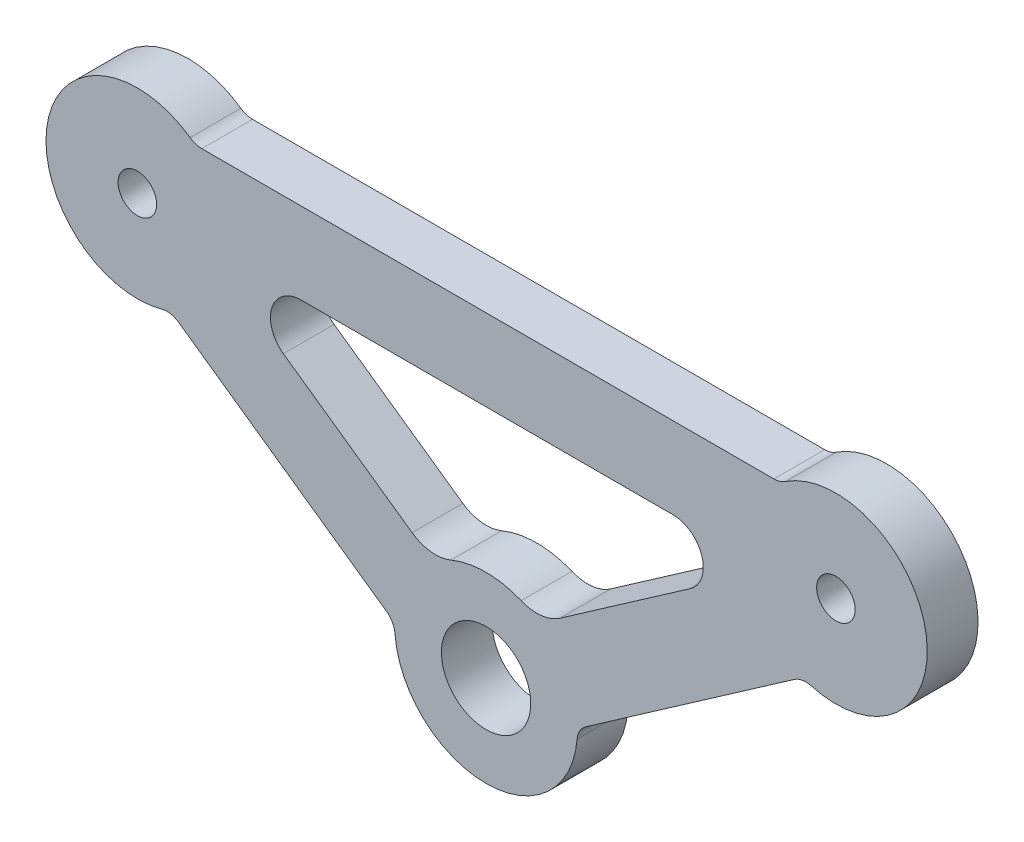
ISO-10303-21;
HEADER;
FILE_DESCRIPTION(('STEP AP214'),'2;1');
FILE_NAME('part.step','',(''),(''),'','','');
FILE_SCHEMA(('AUTOMOTIVE_DESIGN { 1 0 10303 214 1 1 1 1 }'));
ENDSEC;
DATA;
#1=APPLICATION_CONTEXT('core data for automotive mechanical design processes');
#2=APPLICATION_PROTOCOL_DEFINITION('international standard','automotive_design',2000,#1);
#3=PRODUCT_CONTEXT('',#1,'mechanical');
#4=PRODUCT('Part','Part','',(#3));
#5=PRODUCT_RELATED_PRODUCT_CATEGORY('part','',(#4));
#6=PRODUCT_DEFINITION_FORMATION('','',#4);
#7=PRODUCT_DEFINITION_CONTEXT('part definition',#1,'design');
#8=PRODUCT_DEFINITION('design','',#6,#7);
#9=PRODUCT_DEFINITION_SHAPE('','',#8);
#10=(LENGTH_UNIT() NAMED_UNIT(*) SI_UNIT(.MILLI.,.METRE.));
#11=(NAMED_UNIT(*) PLANE_ANGLE_UNIT() SI_UNIT($,.RADIAN.));
#12=(NAMED_UNIT(*) SI_UNIT($,.STERADIAN.) SOLID_ANGLE_UNIT());
#13=UNCERTAINTY_MEASURE_WITH_UNIT(LENGTH_MEASURE(1.E-05),#10,'distance_accuracy_value','');
#14=(GEOMETRIC_REPRESENTATION_CONTEXT(3) GLOBAL_UNCERTAINTY_ASSIGNED_CONTEXT((#13)) GLOBAL_UNIT_ASSIGNED_CONTEXT((#10,
#11,#12)) REPRESENTATION_CONTEXT('',''));
#15=CARTESIAN_POINT('',(0.,0.,0.));
#16=DIRECTION('',(0.,0.,1.));
#17=DIRECTION('',(1.,0.,0.));
#18=AXIS2_PLACEMENT_3D('',#15,#16,#17);
#19=CARTESIAN_POINT('',(28.299853999515,21.0708033574243,5.));
#20=DIRECTION('',(0.,0.,1.));
#21=DIRECTION('',(1.,0.,0.));
#22=AXIS2_PLACEMENT_3D('',#19,#20,#21);
#23=PLANE('',#22);
#24=CARTESIAN_POINT('',(34.404288115788,11.9218843911613,5.));
#25=DIRECTION('',(0.,0.,1.));
#26=DIRECTION('',(1.,0.,0.));
#27=AXIS2_PLACEMENT_3D('',#24,#25,#26);
#28=CIRCLE('',#27,1.90000000000001);
#29=CARTESIAN_POINT('',(36.304288115788,11.9218843911613,5.));
#30=VERTEX_POINT('',#29);
#31=EDGE_CURVE('E606',#30,#30,#28,.T.);
#32=ORIENTED_EDGE('',*,*,#31,.F.);
#33=EDGE_LOOP('',(#32));
#34=FACE_BOUND('',#33,.T.);
#35=DIRECTION('',(0.817782482863186,-0.575527419609285,0.));
#36=VECTOR('',#35,1.);
#37=CARTESIAN_POINT('',(-7.34429215551615,-3.32824710233549,5.));
#38=LINE('',#37,#36);
#39=CARTESIAN_POINT('',(-20.0222709358708,5.59408195975507,5.));
#40=VERTEX_POINT('',#39);
#41=CARTESIAN_POINT('',(-7.34429215551615,-3.32824710233549,5.));
#42=VERTEX_POINT('',#41);
#43=EDGE_CURVE('E177',#40,#42,#38,.T.);
#44=ORIENTED_EDGE('',*,*,#43,.F.);
#45=CARTESIAN_POINT('',(-18.2956882815931,8.04742913004048,5.));
#46=DIRECTION('',(0.,0.,1.));
#47=DIRECTION('',(1.,0.,0.));
#48=AXIS2_PLACEMENT_3D('',#45,#46,#47);
#49=CIRCLE('',#48,3.);
#50=CARTESIAN_POINT('',(-18.2885366112004,11.0474206056301,5.));
#51=VERTEX_POINT('',#50);
#52=EDGE_CURVE('E169',#51,#40,#49,.T.);
#53=ORIENTED_EDGE('',*,*,#52,.F.);
#54=DIRECTION('',(-1.,0.,0.));
#55=VECTOR('',#54,1.);
#56=CARTESIAN_POINT('',(-18.2885366112004,11.0474206056301,5.));
#57=LINE('',#56,#55);
#58=CARTESIAN_POINT('',(18.1736884087304,11.0474206056301,5.));
#59=VERTEX_POINT('',#58);
#60=EDGE_CURVE('E204',#59,#51,#57,.T.);
#61=ORIENTED_EDGE('',*,*,#60,.F.);
#62=CARTESIAN_POINT('',(18.3378786862498,8.05191704983724,5.));
#63=DIRECTION('',(0.,0.,1.));
#64=DIRECTION('',(1.,0.,0.));
#65=AXIS2_PLACEMENT_3D('',#62,#63,#64);
#66=CIRCLE('',#65,2.99999999999996);
#67=CARTESIAN_POINT('',(19.9444859495598,5.51837938454011,5.));
#68=VERTEX_POINT('',#67);
#69=EDGE_CURVE('E202',#68,#59,#66,.T.);
#70=ORIENTED_EDGE('',*,*,#69,.F.);
#71=DIRECTION('',(0.820516963831443,0.571622175973633,0.));
#72=VECTOR('',#71,1.);
#73=CARTESIAN_POINT('',(19.9444859495598,5.51837938454011,5.));
#74=LINE('',#73,#72);
#75=CARTESIAN_POINT('',(7.22411485533596,-3.34340717757911,5.));
#76=VERTEX_POINT('',#75);
#77=EDGE_CURVE('E200',#76,#68,#74,.T.);
#78=ORIENTED_EDGE('',*,*,#77,.F.);
#79=CARTESIAN_POINT('',(4.9376259987999,-0.0613394285928926,5.));
#80=DIRECTION('',(0.,0.,1.));
#81=DIRECTION('',(1.,0.,0.));
#82=AXIS2_PLACEMENT_3D('',#79,#80,#81);
#83=CIRCLE('',#82,3.99999999999988);
#84=CARTESIAN_POINT('',(3.40317764778345,-3.7553167238753,5.));
#85=VERTEX_POINT('',#84);
#86=EDGE_CURVE('E198',#85,#76,#83,.T.);
#87=ORIENTED_EDGE('',*,*,#86,.F.);
#88=CARTESIAN_POINT('',(-0.057424101234993,-12.0862473785344,5.));
#89=DIRECTION('',(0.,0.,-1.));
#90=DIRECTION('',(1.,0.,0.));
#91=AXIS2_PLACEMENT_3D('',#88,#89,#90);
#92=CIRCLE('',#91,9.02109583354748);
#93=CARTESIAN_POINT('',(-3.52536211081546,-3.75836793657828,5.));
#94=VERTEX_POINT('',#93);
#95=EDGE_CURVE('E193',#94,#85,#92,.T.);
#96=ORIENTED_EDGE('',*,*,#95,.F.);
#97=CARTESIAN_POINT('',(-5.04218232494593,-0.0571172779486819,5.));
#98=DIRECTION('',(0.,0.,1.));
#99=DIRECTION('',(1.,0.,0.));
#100=AXIS2_PLACEMENT_3D('',#97,#98,#99);
#101=CIRCLE('',#100,4.00000000000011);
#102=EDGE_CURVE('E191',#42,#94,#101,.T.);
#103=ORIENTED_EDGE('',*,*,#102,.F.);
#104=EDGE_LOOP('',(#44,#53,#61,#70,#78,#87,#96,#103));
#105=FACE_BOUND('',#104,.T.);
#106=CARTESIAN_POINT('',(28.299853999515,21.0708033574243,5.));
#107=DIRECTION('',(0.,0.,-1.));
#108=DIRECTION('',(1.,0.,0.));
#109=AXIS2_PLACEMENT_3D('',#106,#107,#108);
#110=CIRCLE('',#109,1.99999999999999);
#111=CARTESIAN_POINT('',(29.4676417818762,19.4471433882905,5.));
#112=VERTEX_POINT('',#111);
#113=CARTESIAN_POINT('',(28.299853999515,19.0708033574243,5.));
#114=VERTEX_POINT('',#113);
#115=EDGE_CURVE('E237',#112,#114,#110,.T.);
#116=ORIENTED_EDGE('',*,*,#115,.T.);
#117=DIRECTION('',(-1.,0.,0.));
#118=VECTOR('',#117,1.);
#119=CARTESIAN_POINT('',(-28.0582976710345,19.0708033574243,5.));
#120=LINE('',#119,#118);
#121=CARTESIAN_POINT('',(-28.0582976710345,19.0708033574243,5.));
#122=VERTEX_POINT('',#121);
#123=EDGE_CURVE('E240',#114,#122,#120,.T.);
#124=ORIENTED_EDGE('',*,*,#123,.T.);
#125=CARTESIAN_POINT('',(-28.0582976710345,21.0708033574243,5.));
#126=DIRECTION('',(0.,0.,-1.));
#127=DIRECTION('',(1.,0.,0.));
#128=AXIS2_PLACEMENT_3D('',#125,#126,#127);
#129=CIRCLE('',#128,2.00000000000006);
#130=CARTESIAN_POINT('',(-29.2121141155351,19.4371854056375,5.));
#131=VERTEX_POINT('',#130);
#132=EDGE_CURVE('E243',#122,#131,#129,.T.);
#133=ORIENTED_EDGE('',*,*,#132,.T.);
#134=CARTESIAN_POINT('',(-34.4042881157879,12.0859046225972,5.));
#135=DIRECTION('',(0.,0.,1.));
#136=DIRECTION('',(1.,0.,0.));
#137=AXIS2_PLACEMENT_3D('',#134,#135,#136);
#138=CIRCLE('',#137,8.9999999999999);
#139=CARTESIAN_POINT('',(-32.0230341532933,3.40664027784412,5.));
#140=VERTEX_POINT('',#139);
#141=EDGE_CURVE('E245',#131,#140,#138,.T.);
#142=ORIENTED_EDGE('',*,*,#141,.T.);
#143=CARTESIAN_POINT('',(-31.4938666060722,1.47791486789872,5.));
#144=DIRECTION('',(0.,0.,-1.));
#145=DIRECTION('',(1.,0.,0.));
#146=AXIS2_PLACEMENT_3D('',#143,#144,#145);
#147=CIRCLE('',#146,2.00000000000022);
#148=CARTESIAN_POINT('',(-30.3428117868034,3.11347984766532,5.));
#149=VERTEX_POINT('',#148);
#150=EDGE_CURVE('E247',#140,#149,#147,.T.);
#151=ORIENTED_EDGE('',*,*,#150,.T.);
#152=DIRECTION('',(0.817782489883158,-0.575527409634417,0.));
#153=VECTOR('',#152,1.);
#154=CARTESIAN_POINT('',(-9.87417568415933,-11.2916477512239,5.));
#155=LINE('',#154,#153);
#156=CARTESIAN_POINT('',(-9.87417568415933,-11.2916477512239,5.));
#157=VERTEX_POINT('',#156);
#158=EDGE_CURVE('E249',#149,#157,#155,.T.);
#159=ORIENTED_EDGE('',*,*,#158,.T.);
#160=CARTESIAN_POINT('',(-11.025230503428,-12.9272127309903,5.));
#161=DIRECTION('',(0.,0.,-1.));
#162=DIRECTION('',(1.,0.,0.));
#163=AXIS2_PLACEMENT_3D('',#160,#161,#162);
#164=CIRCLE('',#163,2.00000000000005);
#165=CARTESIAN_POINT('',(-9.03108388484751,-12.7743099396347,5.));
#166=VERTEX_POINT('',#165);
#167=EDGE_CURVE('E251',#157,#166,#164,.T.);
#168=ORIENTED_EDGE('',*,*,#167,.T.);
#169=CARTESIAN_POINT('',(-0.057424101234993,-12.0862473785344,5.));
#170=DIRECTION('',(0.,0.,1.));
#171=DIRECTION('',(1.,0.,0.));
#172=AXIS2_PLACEMENT_3D('',#169,#170,#171);
#173=CIRCLE('',#172,9.00000000000041);
#174=CARTESIAN_POINT('',(8.91285342891889,-12.8170832233201,5.));
#175=VERTEX_POINT('',#174);
#176=EDGE_CURVE('E253',#166,#175,#173,.T.);
#177=ORIENTED_EDGE('',*,*,#176,.T.);
#178=CARTESIAN_POINT('',(10.9062484356186,-12.9794911888279,5.));
#179=DIRECTION('',(0.,0.,-1.));
#180=DIRECTION('',(1.,0.,0.));
#181=AXIS2_PLACEMENT_3D('',#178,#179,#180);
#182=CIRCLE('',#181,1.99999999999973);
#183=CARTESIAN_POINT('',(9.76300410368804,-11.3384572472205,5.));
#184=VERTEX_POINT('',#183);
#185=EDGE_CURVE('E255',#175,#184,#182,.T.);
#186=ORIENTED_EDGE('',*,*,#185,.T.);
#187=DIRECTION('',(0.820516970803791,0.571622165965397,0.));
#188=VECTOR('',#187,1.);
#189=CARTESIAN_POINT('',(30.3000827269129,2.96892429750235,5.));
#190=LINE('',#189,#188);
#191=CARTESIAN_POINT('',(30.3000827269129,2.96892429750235,5.));
#192=VERTEX_POINT('',#191);
#193=EDGE_CURVE('E257',#184,#192,#190,.T.);
#194=ORIENTED_EDGE('',*,*,#193,.T.);
#195=CARTESIAN_POINT('',(31.4433270588438,1.32789035589487,5.));
#196=DIRECTION('',(0.,0.,-1.));
#197=DIRECTION('',(1.,0.,0.));
#198=AXIS2_PLACEMENT_3D('',#195,#196,#197);
#199=CIRCLE('',#198,2.00000000000005);
#200=CARTESIAN_POINT('',(31.9816836146518,3.25407108957971,5.));
#201=VERTEX_POINT('',#200);
#202=EDGE_CURVE('E259',#192,#201,#199,.T.);
#203=ORIENTED_EDGE('',*,*,#202,.T.);
#204=CARTESIAN_POINT('',(34.404288115788,11.9218843911613,5.));
#205=DIRECTION('',(0.,0.,1.));
#206=DIRECTION('',(1.,0.,0.));
#207=AXIS2_PLACEMENT_3D('',#204,#205,#206);
#208=CIRCLE('',#207,8.9999999999999);
#209=EDGE_CURVE('E261',#201,#112,#208,.T.);
#210=ORIENTED_EDGE('',*,*,#209,.T.);
#211=EDGE_LOOP('',(#116,#124,#133,#142,#151,#159,#168,#177,#186,#194,#203,#210));
#212=FACE_BOUND('',#211,.T.);
#213=CARTESIAN_POINT('',(-34.4042881157879,12.0859046225972,5.));
#214=DIRECTION('',(0.,0.,1.));
#215=DIRECTION('',(1.,0.,0.));
#216=AXIS2_PLACEMENT_3D('',#213,#214,#215);
#217=CIRCLE('',#216,1.8999999999999);
#218=CARTESIAN_POINT('',(-32.504288115788,12.0859046225972,5.));
#219=VERTEX_POINT('',#218);
#220=EDGE_CURVE('E207',#219,#219,#217,.T.);
#221=ORIENTED_EDGE('',*,*,#220,.F.);
#222=EDGE_LOOP('',(#221));
#223=FACE_BOUND('',#222,.T.);
#224=CARTESIAN_POINT('',(-0.057424101234993,-12.0862473785344,5.));
#225=DIRECTION('',(0.,0.,1.));
#226=DIRECTION('',(1.,0.,0.));
#227=AXIS2_PLACEMENT_3D('',#224,#225,#226);
#228=CIRCLE('',#227,4.39999999999929);
#229=CARTESIAN_POINT('',(4.3425758987643,-12.0862473785344,5.));
#230=VERTEX_POINT('',#229);
#231=EDGE_CURVE('E597',#230,#230,#228,.T.);
#232=ORIENTED_EDGE('',*,*,#231,.F.);
#233=EDGE_LOOP('',(#232));
#234=FACE_BOUND('',#233,.T.);
#235=ADVANCED_FACE('F32',(#34,#105,#212,#223,#234),#23,.T.);
#236=CARTESIAN_POINT('',(28.299853999515,21.0708033574243,0.));
#237=DIRECTION('',(0.,0.,1.));
#238=DIRECTION('',(1.,0.,0.));
#239=AXIS2_PLACEMENT_3D('',#236,#237,#238);
#240=PLANE('',#239);
#241=CARTESIAN_POINT('',(28.299853999515,21.0708033574243,0.));
#242=DIRECTION('',(0.,0.,-1.));
#243=DIRECTION('',(1.,0.,0.));
#244=AXIS2_PLACEMENT_3D('',#241,#242,#243);
#245=CIRCLE('',#244,1.99999999999999);
#246=CARTESIAN_POINT('',(29.4676417818762,19.4471433882905,0.));
#247=VERTEX_POINT('',#246);
#248=CARTESIAN_POINT('',(28.299853999515,19.0708033574243,0.));
#249=VERTEX_POINT('',#248);
#250=EDGE_CURVE('E185',#247,#249,#245,.T.);
#251=ORIENTED_EDGE('',*,*,#250,.F.);
#252=CARTESIAN_POINT('',(34.404288115788,11.9218843911613,0.));
#253=DIRECTION('',(0.,0.,1.));
#254=DIRECTION('',(1.,0.,0.));
#255=AXIS2_PLACEMENT_3D('',#252,#253,#254);
#256=CIRCLE('',#255,8.9999999999999);
#257=CARTESIAN_POINT('',(31.9816836146518,3.25407108957971,0.));
#258=VERTEX_POINT('',#257);
#259=EDGE_CURVE('E241',#258,#247,#256,.T.);
#260=ORIENTED_EDGE('',*,*,#259,.F.);
#261=CARTESIAN_POINT('',(31.4433270588438,1.32789035589487,0.));
#262=DIRECTION('',(0.,0.,-1.));
#263=DIRECTION('',(1.,0.,0.));
#264=AXIS2_PLACEMENT_3D('',#261,#262,#263);
#265=CIRCLE('',#264,2.00000000000005);
#266=CARTESIAN_POINT('',(30.3000827269129,2.96892429750235,0.));
#267=VERTEX_POINT('',#266);
#268=EDGE_CURVE('E284',#267,#258,#265,.T.);
#269=ORIENTED_EDGE('',*,*,#268,.F.);
#270=DIRECTION('',(0.820516970803791,0.571622165965397,0.));
#271=VECTOR('',#270,1.);
#272=CARTESIAN_POINT('',(30.3000827269129,2.96892429750235,0.));
#273=LINE('',#272,#271);
#274=CARTESIAN_POINT('',(9.76300410368804,-11.3384572472205,0.));
#275=VERTEX_POINT('',#274);
#276=EDGE_CURVE('E282',#275,#267,#273,.T.);
#277=ORIENTED_EDGE('',*,*,#276,.F.);
#278=CARTESIAN_POINT('',(10.9062484356186,-12.9794911888279,0.));
#279=DIRECTION('',(0.,0.,-1.));
#280=DIRECTION('',(1.,0.,0.));
#281=AXIS2_PLACEMENT_3D('',#278,#279,#280);
#282=CIRCLE('',#281,1.99999999999973);
#283=CARTESIAN_POINT('',(8.91285342891889,-12.8170832233201,0.));
#284=VERTEX_POINT('',#283);
#285=EDGE_CURVE('E280',#284,#275,#282,.T.);
#286=ORIENTED_EDGE('',*,*,#285,.F.);
#287=CARTESIAN_POINT('',(-0.057424101234993,-12.0862473785344,0.));
#288=DIRECTION('',(0.,0.,1.));
#289=DIRECTION('',(1.,0.,0.));
#290=AXIS2_PLACEMENT_3D('',#287,#288,#289);
#291=CIRCLE('',#290,9.00000000000041);
#292=CARTESIAN_POINT('',(-9.03108388484751,-12.7743099396347,0.));
#293=VERTEX_POINT('',#292);
#294=EDGE_CURVE('E278',#293,#284,#291,.T.);
#295=ORIENTED_EDGE('',*,*,#294,.F.);
#296=CARTESIAN_POINT('',(-11.025230503428,-12.9272127309903,0.));
#297=DIRECTION('',(0.,0.,-1.));
#298=DIRECTION('',(1.,0.,0.));
#299=AXIS2_PLACEMENT_3D('',#296,#297,#298);
#300=CIRCLE('',#299,2.00000000000005);
#301=CARTESIAN_POINT('',(-9.87417568415933,-11.2916477512239,0.));
#302=VERTEX_POINT('',#301);
#303=EDGE_CURVE('E276',#302,#293,#300,.T.);
#304=ORIENTED_EDGE('',*,*,#303,.F.);
#305=DIRECTION('',(0.817782489883158,-0.575527409634417,0.));
#306=VECTOR('',#305,1.);
#307=CARTESIAN_POINT('',(-9.87417568415933,-11.2916477512239,0.));
#308=LINE('',#307,#306);
#309=CARTESIAN_POINT('',(-30.3428117868034,3.11347984766532,0.));
#310=VERTEX_POINT('',#309);
#311=EDGE_CURVE('E274',#310,#302,#308,.T.);
#312=ORIENTED_EDGE('',*,*,#311,.F.);
#313=CARTESIAN_POINT('',(-31.4938666060722,1.47791486789872,0.));
#314=DIRECTION('',(0.,0.,-1.));
#315=DIRECTION('',(1.,0.,0.));
#316=AXIS2_PLACEMENT_3D('',#313,#314,#315);
#317=CIRCLE('',#316,2.00000000000022);
#318=CARTESIAN_POINT('',(-32.0230341532933,3.40664027784412,0.));
#319=VERTEX_POINT('',#318);
#320=EDGE_CURVE('E272',#319,#310,#317,.T.);
#321=ORIENTED_EDGE('',*,*,#320,.F.);
#322=CARTESIAN_POINT('',(-34.4042881157879,12.0859046225972,0.));
#323=DIRECTION('',(0.,0.,1.));
#324=DIRECTION('',(1.,0.,0.));
#325=AXIS2_PLACEMENT_3D('',#322,#323,#324);
#326=CIRCLE('',#325,8.9999999999999);
#327=CARTESIAN_POINT('',(-29.2121141155351,19.4371854056375,0.));
#328=VERTEX_POINT('',#327);
#329=EDGE_CURVE('E270',#328,#319,#326,.T.);
#330=ORIENTED_EDGE('',*,*,#329,.F.);
#331=CARTESIAN_POINT('',(-28.0582976710345,21.0708033574243,0.));
#332=DIRECTION('',(0.,0.,-1.));
#333=DIRECTION('',(1.,0.,0.));
#334=AXIS2_PLACEMENT_3D('',#331,#332,#333);
#335=CIRCLE('',#334,2.00000000000006);
#336=CARTESIAN_POINT('',(-28.0582976710345,19.0708033574243,0.));
#337=VERTEX_POINT('',#336);
#338=EDGE_CURVE('E268',#337,#328,#335,.T.);
#339=ORIENTED_EDGE('',*,*,#338,.F.);
#340=DIRECTION('',(-1.,0.,0.));
#341=VECTOR('',#340,1.);
#342=CARTESIAN_POINT('',(-28.0582976710345,19.0708033574243,0.));
#343=LINE('',#342,#341);
#344=EDGE_CURVE('E266',#249,#337,#343,.T.);
#345=ORIENTED_EDGE('',*,*,#344,.F.);
#346=EDGE_LOOP('',(#251,#260,#269,#277,#286,#295,#304,#312,#321,#330,#339,#345));
#347=FACE_BOUND('',#346,.T.);
#348=CARTESIAN_POINT('',(-18.2956882815931,8.04742913004048,0.));
#349=DIRECTION('',(0.,0.,1.));
#350=DIRECTION('',(1.,0.,0.));
#351=AXIS2_PLACEMENT_3D('',#348,#349,#350);
#352=CIRCLE('',#351,3.);
#353=CARTESIAN_POINT('',(-18.2885366112004,11.0474206056301,0.));
#354=VERTEX_POINT('',#353);
#355=CARTESIAN_POINT('',(-20.0222709358708,5.59408195975507,0.));
#356=VERTEX_POINT('',#355);
#357=EDGE_CURVE('E55',#354,#356,#352,.T.);
#358=ORIENTED_EDGE('',*,*,#357,.T.);
#359=DIRECTION('',(0.817782482863186,-0.575527419609285,0.));
#360=VECTOR('',#359,1.);
#361=CARTESIAN_POINT('',(-7.34429215551615,-3.32824710233549,0.));
#362=LINE('',#361,#360);
#363=CARTESIAN_POINT('',(-7.34429215551615,-3.32824710233549,0.));
#364=VERTEX_POINT('',#363);
#365=EDGE_CURVE('E184',#356,#364,#362,.T.);
#366=ORIENTED_EDGE('',*,*,#365,.T.);
#367=CARTESIAN_POINT('',(-5.04218232494593,-0.0571172779486819,0.));
#368=DIRECTION('',(0.,0.,1.));
#369=DIRECTION('',(1.,0.,0.));
#370=AXIS2_PLACEMENT_3D('',#367,#368,#369);
#371=CIRCLE('',#370,4.00000000000011);
#372=CARTESIAN_POINT('',(-3.52536211081546,-3.75836793657828,0.));
#373=VERTEX_POINT('',#372);
#374=EDGE_CURVE('E209',#364,#373,#371,.T.);
#375=ORIENTED_EDGE('',*,*,#374,.T.);
#376=CARTESIAN_POINT('',(-0.057424101234993,-12.0862473785344,0.));
#377=DIRECTION('',(0.,0.,-1.));
#378=DIRECTION('',(1.,0.,0.));
#379=AXIS2_PLACEMENT_3D('',#376,#377,#378);
#380=CIRCLE('',#379,9.02109583354748);
#381=CARTESIAN_POINT('',(3.40317764778345,-3.7553167238753,0.));
#382=VERTEX_POINT('',#381);
#383=EDGE_CURVE('E212',#373,#382,#380,.T.);
#384=ORIENTED_EDGE('',*,*,#383,.T.);
#385=CARTESIAN_POINT('',(4.9376259987999,-0.0613394285928926,0.));
#386=DIRECTION('',(0.,0.,1.));
#387=DIRECTION('',(1.,0.,0.));
#388=AXIS2_PLACEMENT_3D('',#385,#386,#387);
#389=CIRCLE('',#388,3.99999999999988);
#390=CARTESIAN_POINT('',(7.22411485533596,-3.34340717757911,0.));
#391=VERTEX_POINT('',#390);
#392=EDGE_CURVE('E215',#382,#391,#389,.T.);
#393=ORIENTED_EDGE('',*,*,#392,.T.);
#394=DIRECTION('',(0.820516963831443,0.571622175973633,0.));
#395=VECTOR('',#394,1.);
#396=CARTESIAN_POINT('',(19.9444859495598,5.51837938454011,0.));
#397=LINE('',#396,#395);
#398=CARTESIAN_POINT('',(19.9444859495598,5.51837938454011,0.));
#399=VERTEX_POINT('',#398);
#400=EDGE_CURVE('E218',#391,#399,#397,.T.);
#401=ORIENTED_EDGE('',*,*,#400,.T.);
#402=CARTESIAN_POINT('',(18.3378786862498,8.05191704983724,0.));
#403=DIRECTION('',(0.,0.,1.));
#404=DIRECTION('',(1.,0.,0.));
#405=AXIS2_PLACEMENT_3D('',#402,#403,#404);
#406=CIRCLE('',#405,2.99999999999996);
#407=CARTESIAN_POINT('',(18.1736884087304,11.0474206056301,0.));
#408=VERTEX_POINT('',#407);
#409=EDGE_CURVE('E221',#399,#408,#406,.T.);
#410=ORIENTED_EDGE('',*,*,#409,.T.);
#411=DIRECTION('',(-1.,0.,0.));
#412=VECTOR('',#411,1.);
#413=CARTESIAN_POINT('',(-18.2885366112004,11.0474206056301,0.));
#414=LINE('',#413,#412);
#415=EDGE_CURVE('E178',#408,#354,#414,.T.);
#416=ORIENTED_EDGE('',*,*,#415,.T.);
#417=EDGE_LOOP('',(#358,#366,#375,#384,#393,#401,#410,#416));
#418=FACE_BOUND('',#417,.T.);
#419=CARTESIAN_POINT('',(-34.4042881157879,12.0859046225972,0.));
#420=DIRECTION('',(0.,0.,1.));
#421=DIRECTION('',(1.,0.,0.));
#422=AXIS2_PLACEMENT_3D('',#419,#420,#421);
#423=CIRCLE('',#422,1.8999999999999);
#424=CARTESIAN_POINT('',(-32.504288115788,12.0859046225972,0.));
#425=VERTEX_POINT('',#424);
#426=EDGE_CURVE('E609',#425,#425,#423,.T.);
#427=ORIENTED_EDGE('',*,*,#426,.T.);
#428=EDGE_LOOP('',(#427));
#429=FACE_BOUND('',#428,.T.);
#430=CARTESIAN_POINT('',(34.404288115788,11.9218843911613,0.));
#431=DIRECTION('',(0.,0.,1.));
#432=DIRECTION('',(1.,0.,0.));
#433=AXIS2_PLACEMENT_3D('',#430,#431,#432);
#434=CIRCLE('',#433,1.90000000000001);
#435=CARTESIAN_POINT('',(36.304288115788,11.9218843911613,0.));
#436=VERTEX_POINT('',#435);
#437=EDGE_CURVE('E603',#436,#436,#434,.T.);
#438=ORIENTED_EDGE('',*,*,#437,.T.);
#439=EDGE_LOOP('',(#438));
#440=FACE_BOUND('',#439,.T.);
#441=CARTESIAN_POINT('',(-0.057424101234993,-12.0862473785344,0.));
#442=DIRECTION('',(0.,0.,1.));
#443=DIRECTION('',(1.,0.,0.));
#444=AXIS2_PLACEMENT_3D('',#441,#442,#443);
#445=CIRCLE('',#444,4.39999999999929);
#446=CARTESIAN_POINT('',(4.3425758987643,-12.0862473785344,0.));
#447=VERTEX_POINT('',#446);
#448=EDGE_CURVE('E600',#447,#447,#445,.T.);
#449=ORIENTED_EDGE('',*,*,#448,.T.);
#450=EDGE_LOOP('',(#449));
#451=FACE_BOUND('',#450,.T.);
#452=ADVANCED_FACE('F326',(#347,#418,#429,#440,#451),#240,.F.);
#453=CARTESIAN_POINT('',(28.299853999515,21.0708033574243,5.));
#454=DIRECTION('',(0.,0.,-1.));
#455=DIRECTION('',(-1.,0.,0.));
#456=AXIS2_PLACEMENT_3D('',#453,#454,#455);
#457=CYLINDRICAL_SURFACE('',#456,1.99999999999999);
#458=ORIENTED_EDGE('',*,*,#250,.T.);
#459=DIRECTION('',(0.,0.,-1.));
#460=VECTOR('',#459,1.);
#461=CARTESIAN_POINT('',(28.299853999515,19.0708033574243,5.));
#462=LINE('',#461,#460);
#463=EDGE_CURVE('E11',#114,#249,#462,.T.);
#464=ORIENTED_EDGE('',*,*,#463,.F.);
#465=ORIENTED_EDGE('',*,*,#115,.F.);
#466=DIRECTION('',(0.,0.,-1.));
#467=VECTOR('',#466,1.);
#468=CARTESIAN_POINT('',(29.4676417818762,19.4471433882905,5.));
#469=LINE('',#468,#467);
#470=EDGE_CURVE('E263',#112,#247,#469,.T.);
#471=ORIENTED_EDGE('',*,*,#470,.T.);
#472=EDGE_LOOP('',(#458,#464,#465,#471));
#473=FACE_BOUND('',#472,.T.);
#474=ADVANCED_FACE('F34',(#473),#457,.F.);
#475=CARTESIAN_POINT('',(-28.0582976710345,19.0708033574243,5.));
#476=DIRECTION('',(0.,-1.,0.));
#477=DIRECTION('',(1.,0.,0.));
#478=AXIS2_PLACEMENT_3D('',#475,#476,#477);
#479=PLANE('',#478);
#480=ORIENTED_EDGE('',*,*,#344,.T.);
#481=DIRECTION('',(0.,0.,-1.));
#482=VECTOR('',#481,1.);
#483=CARTESIAN_POINT('',(-28.0582976710345,19.0708033574243,5.));
#484=LINE('',#483,#482);
#485=EDGE_CURVE('E40',#122,#337,#484,.T.);
#486=ORIENTED_EDGE('',*,*,#485,.F.);
#487=ORIENTED_EDGE('',*,*,#123,.F.);
#488=ORIENTED_EDGE('',*,*,#463,.T.);
#489=EDGE_LOOP('',(#480,#486,#487,#488));
#490=FACE_BOUND('',#489,.T.);
#491=ADVANCED_FACE('F343',(#490),#479,.F.);
#492=CARTESIAN_POINT('',(-28.0582976710345,21.0708033574243,5.));
#493=DIRECTION('',(0.,0.,-1.));
#494=DIRECTION('',(-1.,0.,0.));
#495=AXIS2_PLACEMENT_3D('',#492,#493,#494);
#496=CYLINDRICAL_SURFACE('',#495,2.00000000000006);
#497=ORIENTED_EDGE('',*,*,#338,.T.);
#498=DIRECTION('',(0.,0.,-1.));
#499=VECTOR('',#498,1.);
#500=CARTESIAN_POINT('',(-29.2121141155351,19.4371854056375,5.));
#501=LINE('',#500,#499);
#502=EDGE_CURVE('E313',#131,#328,#501,.T.);
#503=ORIENTED_EDGE('',*,*,#502,.F.);
#504=ORIENTED_EDGE('',*,*,#132,.F.);
#505=ORIENTED_EDGE('',*,*,#485,.T.);
#506=EDGE_LOOP('',(#497,#503,#504,#505));
#507=FACE_BOUND('',#506,.T.);
#508=ADVANCED_FACE('F320',(#507),#496,.F.);
#509=CARTESIAN_POINT('',(-34.4042881157879,12.0859046225972,5.));
#510=DIRECTION('',(0.,0.,-1.));
#511=DIRECTION('',(-1.,0.,0.));
#512=AXIS2_PLACEMENT_3D('',#509,#510,#511);
#513=CYLINDRICAL_SURFACE('',#512,8.9999999999999);
#514=ORIENTED_EDGE('',*,*,#329,.T.);
#515=DIRECTION('',(0.,0.,-1.));
#516=VECTOR('',#515,1.);
#517=CARTESIAN_POINT('',(-32.0230341532933,3.40664027784412,5.));
#518=LINE('',#517,#516);
#519=EDGE_CURVE('E310',#140,#319,#518,.T.);
#520=ORIENTED_EDGE('',*,*,#519,.F.);
#521=ORIENTED_EDGE('',*,*,#141,.F.);
#522=ORIENTED_EDGE('',*,*,#502,.T.);
#523=EDGE_LOOP('',(#514,#520,#521,#522));
#524=FACE_BOUND('',#523,.T.);
#525=ADVANCED_FACE('F332',(#524),#513,.T.);
#526=CARTESIAN_POINT('',(-31.4938666060722,1.47791486789872,5.));
#527=DIRECTION('',(0.,0.,-1.));
#528=DIRECTION('',(-1.,0.,0.));
#529=AXIS2_PLACEMENT_3D('',#526,#527,#528);
#530=CYLINDRICAL_SURFACE('',#529,2.00000000000022);
#531=ORIENTED_EDGE('',*,*,#320,.T.);
#532=DIRECTION('',(0.,0.,-1.));
#533=VECTOR('',#532,1.);
#534=CARTESIAN_POINT('',(-30.3428117868034,3.11347984766532,5.));
#535=LINE('',#534,#533);
#536=EDGE_CURVE('E307',#149,#310,#535,.T.);
#537=ORIENTED_EDGE('',*,*,#536,.F.);
#538=ORIENTED_EDGE('',*,*,#150,.F.);
#539=ORIENTED_EDGE('',*,*,#519,.T.);
#540=EDGE_LOOP('',(#531,#537,#538,#539));
#541=FACE_BOUND('',#540,.T.);
#542=ADVANCED_FACE('F336',(#541),#530,.F.);
#543=CARTESIAN_POINT('',(-9.87417568415933,-11.2916477512239,5.));
#544=DIRECTION('',(0.575527409634417,0.817782489883158,0.));
#545=DIRECTION('',(-0.817782489883158,0.575527409634417,0.));
#546=AXIS2_PLACEMENT_3D('',#543,#544,#545);
#547=PLANE('',#546);
#548=ORIENTED_EDGE('',*,*,#311,.T.);
#549=DIRECTION('',(0.,0.,-1.));
#550=VECTOR('',#549,1.);
#551=CARTESIAN_POINT('',(-9.87417568415933,-11.2916477512239,5.));
#552=LINE('',#551,#550);
#553=EDGE_CURVE('E304',#157,#302,#552,.T.);
#554=ORIENTED_EDGE('',*,*,#553,.F.);
#555=ORIENTED_EDGE('',*,*,#158,.F.);
#556=ORIENTED_EDGE('',*,*,#536,.T.);
#557=EDGE_LOOP('',(#548,#554,#555,#556));
#558=FACE_BOUND('',#557,.T.);
#559=ADVANCED_FACE('F376',(#558),#547,.F.);
#560=CARTESIAN_POINT('',(-11.025230503428,-12.9272127309903,5.));
#561=DIRECTION('',(0.,0.,-1.));
#562=DIRECTION('',(-1.,0.,0.));
#563=AXIS2_PLACEMENT_3D('',#560,#561,#562);
#564=CYLINDRICAL_SURFACE('',#563,2.00000000000005);
#565=ORIENTED_EDGE('',*,*,#303,.T.);
#566=DIRECTION('',(0.,0.,-1.));
#567=VECTOR('',#566,1.);
#568=CARTESIAN_POINT('',(-9.03108388484751,-12.7743099396347,5.));
#569=LINE('',#568,#567);
#570=EDGE_CURVE('E301',#166,#293,#569,.T.);
#571=ORIENTED_EDGE('',*,*,#570,.F.);
#572=ORIENTED_EDGE('',*,*,#167,.F.);
#573=ORIENTED_EDGE('',*,*,#553,.T.);
#574=EDGE_LOOP('',(#565,#571,#572,#573));
#575=FACE_BOUND('',#574,.T.);
#576=ADVANCED_FACE('F374',(#575),#564,.F.);
#577=CARTESIAN_POINT('',(-0.057424101234993,-12.0862473785344,5.));
#578=DIRECTION('',(0.,0.,-1.));
#579=DIRECTION('',(-1.,0.,0.));
#580=AXIS2_PLACEMENT_3D('',#577,#578,#579);
#581=CYLINDRICAL_SURFACE('',#580,9.00000000000041);
#582=ORIENTED_EDGE('',*,*,#294,.T.);
#583=DIRECTION('',(0.,0.,-1.));
#584=VECTOR('',#583,1.);
#585=CARTESIAN_POINT('',(8.91285342891889,-12.8170832233201,5.));
#586=LINE('',#585,#584);
#587=EDGE_CURVE('E298',#175,#284,#586,.T.);
#588=ORIENTED_EDGE('',*,*,#587,.F.);
#589=ORIENTED_EDGE('',*,*,#176,.F.);
#590=ORIENTED_EDGE('',*,*,#570,.T.);
#591=EDGE_LOOP('',(#582,#588,#589,#590));
#592=FACE_BOUND('',#591,.T.);
#593=ADVANCED_FACE('F370',(#592),#581,.T.);
#594=CARTESIAN_POINT('',(10.9062484356186,-12.9794911888279,5.));
#595=DIRECTION('',(0.,0.,-1.));
#596=DIRECTION('',(-1.,0.,0.));
#597=AXIS2_PLACEMENT_3D('',#594,#595,#596);
#598=CYLINDRICAL_SURFACE('',#597,1.99999999999973);
#599=ORIENTED_EDGE('',*,*,#285,.T.);
#600=DIRECTION('',(0.,0.,-1.));
#601=VECTOR('',#600,1.);
#602=CARTESIAN_POINT('',(9.76300410368804,-11.3384572472205,5.));
#603=LINE('',#602,#601);
#604=EDGE_CURVE('E295',#184,#275,#603,.T.);
#605=ORIENTED_EDGE('',*,*,#604,.F.);
#606=ORIENTED_EDGE('',*,*,#185,.F.);
#607=ORIENTED_EDGE('',*,*,#587,.T.);
#608=EDGE_LOOP('',(#599,#605,#606,#607));
#609=FACE_BOUND('',#608,.T.);
#610=ADVANCED_FACE('F365',(#609),#598,.F.);
#611=CARTESIAN_POINT('',(30.3000827269129,2.96892429750235,5.));
#612=DIRECTION('',(-0.571622165965397,0.820516970803791,0.));
#613=DIRECTION('',(-0.820516970803791,-0.571622165965397,0.));
#614=AXIS2_PLACEMENT_3D('',#611,#612,#613);
#615=PLANE('',#614);
#616=ORIENTED_EDGE('',*,*,#276,.T.);
#617=DIRECTION('',(0.,0.,-1.));
#618=VECTOR('',#617,1.);
#619=CARTESIAN_POINT('',(30.3000827269129,2.96892429750235,5.));
#620=LINE('',#619,#618);
#621=EDGE_CURVE('E292',#192,#267,#620,.T.);
#622=ORIENTED_EDGE('',*,*,#621,.F.);
#623=ORIENTED_EDGE('',*,*,#193,.F.);
#624=ORIENTED_EDGE('',*,*,#604,.T.);
#625=EDGE_LOOP('',(#616,#622,#623,#624));
#626=FACE_BOUND('',#625,.T.);
#627=ADVANCED_FACE('F359',(#626),#615,.F.);
#628=CARTESIAN_POINT('',(31.4433270588438,1.32789035589487,5.));
#629=DIRECTION('',(0.,0.,-1.));
#630=DIRECTION('',(-1.,0.,0.));
#631=AXIS2_PLACEMENT_3D('',#628,#629,#630);
#632=CYLINDRICAL_SURFACE('',#631,2.00000000000005);
#633=ORIENTED_EDGE('',*,*,#268,.T.);
#634=DIRECTION('',(0.,0.,-1.));
#635=VECTOR('',#634,1.);
#636=CARTESIAN_POINT('',(31.9816836146518,3.25407108957971,5.));
#637=LINE('',#636,#635);
#638=EDGE_CURVE('E289',#201,#258,#637,.T.);
#639=ORIENTED_EDGE('',*,*,#638,.F.);
#640=ORIENTED_EDGE('',*,*,#202,.F.);
#641=ORIENTED_EDGE('',*,*,#621,.T.);
#642=EDGE_LOOP('',(#633,#639,#640,#641));
#643=FACE_BOUND('',#642,.T.);
#644=ADVANCED_FACE('F355',(#643),#632,.F.);
#645=CARTESIAN_POINT('',(34.404288115788,11.9218843911613,5.));
#646=DIRECTION('',(0.,0.,-1.));
#647=DIRECTION('',(-1.,0.,0.));
#648=AXIS2_PLACEMENT_3D('',#645,#646,#647);
#649=CYLINDRICAL_SURFACE('',#648,8.9999999999999);
#650=ORIENTED_EDGE('',*,*,#259,.T.);
#651=ORIENTED_EDGE('',*,*,#470,.F.);
#652=ORIENTED_EDGE('',*,*,#209,.F.);
#653=ORIENTED_EDGE('',*,*,#638,.T.);
#654=EDGE_LOOP('',(#650,#651,#652,#653));
#655=FACE_BOUND('',#654,.T.);
#656=ADVANCED_FACE('F350',(#655),#649,.T.);
#657=CARTESIAN_POINT('',(-18.2956882815931,8.04742913004048,5.));
#658=DIRECTION('',(0.,0.,-1.));
#659=DIRECTION('',(-1.,0.,0.));
#660=AXIS2_PLACEMENT_3D('',#657,#658,#659);
#661=CYLINDRICAL_SURFACE('',#660,3.);
#662=ORIENTED_EDGE('',*,*,#357,.F.);
#663=DIRECTION('',(0.,0.,-1.));
#664=VECTOR('',#663,1.);
#665=CARTESIAN_POINT('',(-18.2885366112004,11.0474206056301,5.));
#666=LINE('',#665,#664);
#667=EDGE_CURVE('E173',#51,#354,#666,.T.);
#668=ORIENTED_EDGE('',*,*,#667,.F.);
#669=ORIENTED_EDGE('',*,*,#52,.T.);
#670=DIRECTION('',(0.,0.,-1.));
#671=VECTOR('',#670,1.);
#672=CARTESIAN_POINT('',(-20.0222709358708,5.59408195975507,5.));
#673=LINE('',#672,#671);
#674=EDGE_CURVE('E172',#40,#356,#673,.T.);
#675=ORIENTED_EDGE('',*,*,#674,.T.);
#676=EDGE_LOOP('',(#662,#668,#669,#675));
#677=FACE_BOUND('',#676,.T.);
#678=ADVANCED_FACE('F171',(#677),#661,.F.);
#679=CARTESIAN_POINT('',(-7.34429215551615,-3.32824710233549,5.));
#680=DIRECTION('',(0.575527419609285,0.817782482863186,0.));
#681=DIRECTION('',(-0.817782482863186,0.575527419609285,0.));
#682=AXIS2_PLACEMENT_3D('',#679,#680,#681);
#683=PLANE('',#682);
#684=ORIENTED_EDGE('',*,*,#365,.F.);
#685=ORIENTED_EDGE('',*,*,#674,.F.);
#686=ORIENTED_EDGE('',*,*,#43,.T.);
#687=DIRECTION('',(0.,0.,-1.));
#688=VECTOR('',#687,1.);
#689=CARTESIAN_POINT('',(-7.34429215551615,-3.32824710233549,5.));
#690=LINE('',#689,#688);
#691=EDGE_CURVE('E186',#42,#364,#690,.T.);
#692=ORIENTED_EDGE('',*,*,#691,.T.);
#693=EDGE_LOOP('',(#684,#685,#686,#692));
#694=FACE_BOUND('',#693,.T.);
#695=ADVANCED_FACE('F181',(#694),#683,.T.);
#696=CARTESIAN_POINT('',(-5.04218232494593,-0.0571172779486819,5.));
#697=DIRECTION('',(0.,0.,-1.));
#698=DIRECTION('',(-1.,0.,0.));
#699=AXIS2_PLACEMENT_3D('',#696,#697,#698);
#700=CYLINDRICAL_SURFACE('',#699,4.00000000000011);
#701=ORIENTED_EDGE('',*,*,#374,.F.);
#702=ORIENTED_EDGE('',*,*,#691,.F.);
#703=ORIENTED_EDGE('',*,*,#102,.T.);
#704=DIRECTION('',(0.,0.,-1.));
#705=VECTOR('',#704,1.);
#706=CARTESIAN_POINT('',(-3.52536211081546,-3.75836793657828,5.));
#707=LINE('',#706,#705);
#708=EDGE_CURVE('E234',#94,#373,#707,.T.);
#709=ORIENTED_EDGE('',*,*,#708,.T.);
#710=EDGE_LOOP('',(#701,#702,#703,#709));
#711=FACE_BOUND('',#710,.T.);
#712=ADVANCED_FACE('F436',(#711),#700,.F.);
#713=CARTESIAN_POINT('',(-0.057424101234993,-12.0862473785344,5.));
#714=DIRECTION('',(0.,0.,-1.));
#715=DIRECTION('',(-1.,0.,0.));
#716=AXIS2_PLACEMENT_3D('',#713,#714,#715);
#717=CYLINDRICAL_SURFACE('',#716,9.02109583354748);
#718=ORIENTED_EDGE('',*,*,#383,.F.);
#719=ORIENTED_EDGE('',*,*,#708,.F.);
#720=ORIENTED_EDGE('',*,*,#95,.T.);
#721=DIRECTION('',(0.,0.,-1.));
#722=VECTOR('',#721,1.);
#723=CARTESIAN_POINT('',(3.40317764778345,-3.7553167238753,5.));
#724=LINE('',#723,#722);
#725=EDGE_CURVE('E232',#85,#382,#724,.T.);
#726=ORIENTED_EDGE('',*,*,#725,.T.);
#727=EDGE_LOOP('',(#718,#719,#720,#726));
#728=FACE_BOUND('',#727,.T.);
#729=ADVANCED_FACE('F442',(#728),#717,.T.);
#730=CARTESIAN_POINT('',(4.9376259987999,-0.0613394285928926,5.));
#731=DIRECTION('',(0.,0.,-1.));
#732=DIRECTION('',(-1.,0.,0.));
#733=AXIS2_PLACEMENT_3D('',#730,#731,#732);
#734=CYLINDRICAL_SURFACE('',#733,3.99999999999988);
#735=ORIENTED_EDGE('',*,*,#392,.F.);
#736=ORIENTED_EDGE('',*,*,#725,.F.);
#737=ORIENTED_EDGE('',*,*,#86,.T.);
#738=DIRECTION('',(0.,0.,-1.));
#739=VECTOR('',#738,1.);
#740=CARTESIAN_POINT('',(7.22411485533596,-3.34340717757911,5.));
#741=LINE('',#740,#739);
#742=EDGE_CURVE('E230',#76,#391,#741,.T.);
#743=ORIENTED_EDGE('',*,*,#742,.T.);
#744=EDGE_LOOP('',(#735,#736,#737,#743));
#745=FACE_BOUND('',#744,.T.);
#746=ADVANCED_FACE('F450',(#745),#734,.F.);
#747=CARTESIAN_POINT('',(19.9444859495598,5.51837938454011,5.));
#748=DIRECTION('',(-0.571622175973633,0.820516963831443,0.));
#749=DIRECTION('',(-0.820516963831443,-0.571622175973633,0.));
#750=AXIS2_PLACEMENT_3D('',#747,#748,#749);
#751=PLANE('',#750);
#752=ORIENTED_EDGE('',*,*,#400,.F.);
#753=ORIENTED_EDGE('',*,*,#742,.F.);
#754=ORIENTED_EDGE('',*,*,#77,.T.);
#755=DIRECTION('',(0.,0.,-1.));
#756=VECTOR('',#755,1.);
#757=CARTESIAN_POINT('',(19.9444859495598,5.51837938454011,5.));
#758=LINE('',#757,#756);
#759=EDGE_CURVE('E228',#68,#399,#758,.T.);
#760=ORIENTED_EDGE('',*,*,#759,.T.);
#761=EDGE_LOOP('',(#752,#753,#754,#760));
#762=FACE_BOUND('',#761,.T.);
#763=ADVANCED_FACE('F458',(#762),#751,.T.);
#764=CARTESIAN_POINT('',(18.3378786862498,8.05191704983724,5.));
#765=DIRECTION('',(0.,0.,-1.));
#766=DIRECTION('',(-1.,0.,0.));
#767=AXIS2_PLACEMENT_3D('',#764,#765,#766);
#768=CYLINDRICAL_SURFACE('',#767,2.99999999999996);
#769=ORIENTED_EDGE('',*,*,#409,.F.);
#770=ORIENTED_EDGE('',*,*,#759,.F.);
#771=ORIENTED_EDGE('',*,*,#69,.T.);
#772=DIRECTION('',(0.,0.,-1.));
#773=VECTOR('',#772,1.);
#774=CARTESIAN_POINT('',(18.1736884087304,11.0474206056301,5.));
#775=LINE('',#774,#773);
#776=EDGE_CURVE('E47',#59,#408,#775,.T.);
#777=ORIENTED_EDGE('',*,*,#776,.T.);
#778=EDGE_LOOP('',(#769,#770,#771,#777));
#779=FACE_BOUND('',#778,.T.);
#780=ADVANCED_FACE('F466',(#779),#768,.F.);
#781=CARTESIAN_POINT('',(-18.2885366112004,11.0474206056301,5.));
#782=DIRECTION('',(0.,-1.,0.));
#783=DIRECTION('',(1.,0.,0.));
#784=AXIS2_PLACEMENT_3D('',#781,#782,#783);
#785=PLANE('',#784);
#786=ORIENTED_EDGE('',*,*,#415,.F.);
#787=ORIENTED_EDGE('',*,*,#776,.F.);
#788=ORIENTED_EDGE('',*,*,#60,.T.);
#789=ORIENTED_EDGE('',*,*,#667,.T.);
#790=EDGE_LOOP('',(#786,#787,#788,#789));
#791=FACE_BOUND('',#790,.T.);
#792=ADVANCED_FACE('F474',(#791),#785,.T.);
#793=CARTESIAN_POINT('',(-34.4042881157879,12.0859046225972,5.));
#794=DIRECTION('',(0.,0.,-1.));
#795=DIRECTION('',(-1.,0.,0.));
#796=AXIS2_PLACEMENT_3D('',#793,#794,#795);
#797=CYLINDRICAL_SURFACE('',#796,1.8999999999999);
#798=ORIENTED_EDGE('',*,*,#220,.T.);
#799=EDGE_LOOP('',(#798));
#800=FACE_BOUND('',#799,.T.);
#801=ORIENTED_EDGE('',*,*,#426,.F.);
#802=EDGE_LOOP('',(#801));
#803=FACE_BOUND('',#802,.T.);
#804=ADVANCED_FACE('F482',(#800,#803),#797,.F.);
#805=CARTESIAN_POINT('',(34.404288115788,11.9218843911613,5.));
#806=DIRECTION('',(0.,0.,-1.));
#807=DIRECTION('',(-1.,0.,0.));
#808=AXIS2_PLACEMENT_3D('',#805,#806,#807);
#809=CYLINDRICAL_SURFACE('',#808,1.90000000000001);
#810=ORIENTED_EDGE('',*,*,#31,.T.);
#811=EDGE_LOOP('',(#810));
#812=FACE_BOUND('',#811,.T.);
#813=ORIENTED_EDGE('',*,*,#437,.F.);
#814=EDGE_LOOP('',(#813));
#815=FACE_BOUND('',#814,.T.);
#816=ADVANCED_FACE('F489',(#812,#815),#809,.F.);
#817=CARTESIAN_POINT('',(-0.057424101234993,-12.0862473785344,5.));
#818=DIRECTION('',(0.,0.,-1.));
#819=DIRECTION('',(-1.,0.,0.));
#820=AXIS2_PLACEMENT_3D('',#817,#818,#819);
#821=CYLINDRICAL_SURFACE('',#820,4.39999999999929);
#822=ORIENTED_EDGE('',*,*,#231,.T.);
#823=EDGE_LOOP('',(#822));
#824=FACE_BOUND('',#823,.T.);
#825=ORIENTED_EDGE('',*,*,#448,.F.);
#826=EDGE_LOOP('',(#825));
#827=FACE_BOUND('',#826,.T.);
#828=ADVANCED_FACE('F497',(#824,#827),#821,.F.);
#829=CLOSED_SHELL('',(#235,#452,#474,#491,#508,#525,#542,#559,#576,#593,#610,#627,#644,#656,
#678,#695,#712,#729,#746,#763,#780,#792,#804,#816,#828));
#830=MANIFOLD_SOLID_BREP('B2',#829);
#831=ADVANCED_BREP_SHAPE_REPRESENTATION('',(#18,#830),#14);
#832=SHAPE_DEFINITION_REPRESENTATION(#9,#831);
ENDSEC;
END-ISO-10303-21;
